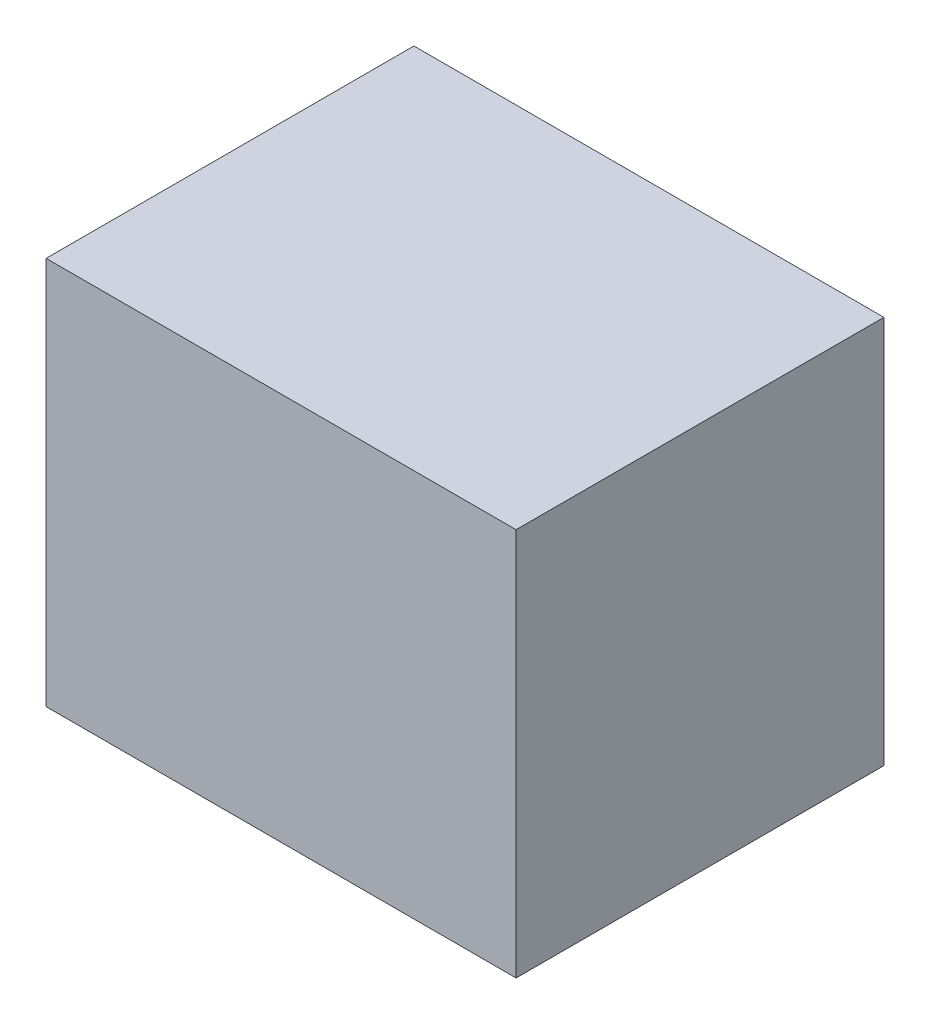
ISO-10303-21;
HEADER;
FILE_DESCRIPTION(('STEP AP214'),'2;1');
FILE_NAME('part.step','',(''),(''),'','','');
FILE_SCHEMA(('AUTOMOTIVE_DESIGN { 1 0 10303 214 1 1 1 1 }'));
ENDSEC;
DATA;
#1=APPLICATION_CONTEXT('core data for automotive mechanical design processes');
#2=APPLICATION_PROTOCOL_DEFINITION('international standard','automotive_design',2000,#1);
#3=PRODUCT_CONTEXT('',#1,'mechanical');
#4=PRODUCT('Part','Part','',(#3));
#5=PRODUCT_RELATED_PRODUCT_CATEGORY('part','',(#4));
#6=PRODUCT_DEFINITION_FORMATION('','',#4);
#7=PRODUCT_DEFINITION_CONTEXT('part definition',#1,'design');
#8=PRODUCT_DEFINITION('design','',#6,#7);
#9=PRODUCT_DEFINITION_SHAPE('','',#8);
#10=(LENGTH_UNIT() NAMED_UNIT(*) SI_UNIT(.MILLI.,.METRE.));
#11=(NAMED_UNIT(*) PLANE_ANGLE_UNIT() SI_UNIT($,.RADIAN.));
#12=(NAMED_UNIT(*) SI_UNIT($,.STERADIAN.) SOLID_ANGLE_UNIT());
#13=UNCERTAINTY_MEASURE_WITH_UNIT(LENGTH_MEASURE(1.E-05),#10,'distance_accuracy_value','');
#14=(GEOMETRIC_REPRESENTATION_CONTEXT(3) GLOBAL_UNCERTAINTY_ASSIGNED_CONTEXT((#13)) GLOBAL_UNIT_ASSIGNED_CONTEXT((#10,
#11,#12)) REPRESENTATION_CONTEXT('',''));
#15=CARTESIAN_POINT('',(0.,0.,0.));
#16=DIRECTION('',(0.,0.,1.));
#17=DIRECTION('',(1.,0.,0.));
#18=AXIS2_PLACEMENT_3D('',#15,#16,#17);
#19=CARTESIAN_POINT('',(0.57500012,0.47500032,0.));
#20=DIRECTION('',(1.,0.,0.));
#21=DIRECTION('',(0.,-1.,0.));
#22=AXIS2_PLACEMENT_3D('',#19,#20,#21);
#23=PLANE('',#22);
#24=DIRECTION('',(0.,0.,1.));
#25=VECTOR('',#24,1.);
#26=CARTESIAN_POINT('',(0.57500012,0.47500032,0.));
#27=LINE('',#26,#25);
#28=CARTESIAN_POINT('',(0.57500012,0.47500032,0.));
#29=VERTEX_POINT('',#28);
#30=CARTESIAN_POINT('',(0.57500012,0.47500032,0.90000074));
#31=VERTEX_POINT('',#30);
#32=EDGE_CURVE('E11',#29,#31,#27,.T.);
#33=ORIENTED_EDGE('',*,*,#32,.T.);
#34=DIRECTION('',(0.,-1.,0.));
#35=VECTOR('',#34,1.);
#36=CARTESIAN_POINT('',(0.57500012,0.47500032,0.90000074));
#37=LINE('',#36,#35);
#38=CARTESIAN_POINT('',(0.57500012,-0.47500032,0.90000074));
#39=VERTEX_POINT('',#38);
#40=EDGE_CURVE('E24',#31,#39,#37,.T.);
#41=ORIENTED_EDGE('',*,*,#40,.T.);
#42=DIRECTION('',(0.,0.,1.));
#43=VECTOR('',#42,1.);
#44=CARTESIAN_POINT('',(0.57500012,-0.47500032,0.));
#45=LINE('',#44,#43);
#46=CARTESIAN_POINT('',(0.57500012,-0.47500032,0.));
#47=VERTEX_POINT('',#46);
#48=EDGE_CURVE('E85',#47,#39,#45,.T.);
#49=ORIENTED_EDGE('',*,*,#48,.F.);
#50=DIRECTION('',(0.,-1.,0.));
#51=VECTOR('',#50,1.);
#52=CARTESIAN_POINT('',(0.57500012,0.47500032,0.));
#53=LINE('',#52,#51);
#54=EDGE_CURVE('E83',#29,#47,#53,.T.);
#55=ORIENTED_EDGE('',*,*,#54,.F.);
#56=EDGE_LOOP('',(#33,#41,#49,#55));
#57=FACE_BOUND('',#56,.T.);
#58=ADVANCED_FACE('F17',(#57),#23,.T.);
#59=CARTESIAN_POINT('',(0.57500012,-0.47500032,0.));
#60=DIRECTION('',(0.,-1.,0.));
#61=DIRECTION('',(-1.,0.,0.));
#62=AXIS2_PLACEMENT_3D('',#59,#60,#61);
#63=PLANE('',#62);
#64=ORIENTED_EDGE('',*,*,#48,.T.);
#65=DIRECTION('',(-1.,0.,0.));
#66=VECTOR('',#65,1.);
#67=CARTESIAN_POINT('',(0.57500012,-0.47500032,0.90000074));
#68=LINE('',#67,#66);
#69=CARTESIAN_POINT('',(-0.57500012,-0.47500032,0.90000074));
#70=VERTEX_POINT('',#69);
#71=EDGE_CURVE('E81',#39,#70,#68,.T.);
#72=ORIENTED_EDGE('',*,*,#71,.T.);
#73=DIRECTION('',(0.,0.,1.));
#74=VECTOR('',#73,1.);
#75=CARTESIAN_POINT('',(-0.57500012,-0.47500032,0.));
#76=LINE('',#75,#74);
#77=CARTESIAN_POINT('',(-0.57500012,-0.47500032,0.));
#78=VERTEX_POINT('',#77);
#79=EDGE_CURVE('E79',#78,#70,#76,.T.);
#80=ORIENTED_EDGE('',*,*,#79,.F.);
#81=DIRECTION('',(-1.,0.,0.));
#82=VECTOR('',#81,1.);
#83=CARTESIAN_POINT('',(0.57500012,-0.47500032,0.));
#84=LINE('',#83,#82);
#85=EDGE_CURVE('E70',#47,#78,#84,.T.);
#86=ORIENTED_EDGE('',*,*,#85,.F.);
#87=EDGE_LOOP('',(#64,#72,#80,#86));
#88=FACE_BOUND('',#87,.T.);
#89=ADVANCED_FACE('F90',(#88),#63,.T.);
#90=CARTESIAN_POINT('',(-0.57500012,-0.47500032,0.));
#91=DIRECTION('',(-1.,0.,0.));
#92=DIRECTION('',(0.,1.,0.));
#93=AXIS2_PLACEMENT_3D('',#90,#91,#92);
#94=PLANE('',#93);
#95=ORIENTED_EDGE('',*,*,#79,.T.);
#96=DIRECTION('',(0.,1.,0.));
#97=VECTOR('',#96,1.);
#98=CARTESIAN_POINT('',(-0.57500012,-0.47500032,0.90000074));
#99=LINE('',#98,#97);
#100=CARTESIAN_POINT('',(-0.57500012,0.47500032,0.90000074));
#101=VERTEX_POINT('',#100);
#102=EDGE_CURVE('E60',#70,#101,#99,.T.);
#103=ORIENTED_EDGE('',*,*,#102,.T.);
#104=DIRECTION('',(0.,0.,1.));
#105=VECTOR('',#104,1.);
#106=CARTESIAN_POINT('',(-0.57500012,0.47500032,0.));
#107=LINE('',#106,#105);
#108=CARTESIAN_POINT('',(-0.57500012,0.47500032,0.));
#109=VERTEX_POINT('',#108);
#110=EDGE_CURVE('E54',#109,#101,#107,.T.);
#111=ORIENTED_EDGE('',*,*,#110,.F.);
#112=DIRECTION('',(0.,1.,0.));
#113=VECTOR('',#112,1.);
#114=CARTESIAN_POINT('',(-0.57500012,-0.47500032,0.));
#115=LINE('',#114,#113);
#116=EDGE_CURVE('E58',#78,#109,#115,.T.);
#117=ORIENTED_EDGE('',*,*,#116,.F.);
#118=EDGE_LOOP('',(#95,#103,#111,#117));
#119=FACE_BOUND('',#118,.T.);
#120=ADVANCED_FACE('F57',(#119),#94,.T.);
#121=CARTESIAN_POINT('',(-0.57500012,0.47500032,0.));
#122=DIRECTION('',(0.,1.,0.));
#123=DIRECTION('',(1.,0.,0.));
#124=AXIS2_PLACEMENT_3D('',#121,#122,#123);
#125=PLANE('',#124);
#126=ORIENTED_EDGE('',*,*,#110,.T.);
#127=DIRECTION('',(1.,0.,0.));
#128=VECTOR('',#127,1.);
#129=CARTESIAN_POINT('',(-0.57500012,0.47500032,0.90000074));
#130=LINE('',#129,#128);
#131=EDGE_CURVE('E71',#101,#31,#130,.T.);
#132=ORIENTED_EDGE('',*,*,#131,.T.);
#133=ORIENTED_EDGE('',*,*,#32,.F.);
#134=DIRECTION('',(1.,0.,0.));
#135=VECTOR('',#134,1.);
#136=CARTESIAN_POINT('',(-0.57500012,0.47500032,0.));
#137=LINE('',#136,#135);
#138=EDGE_CURVE('E68',#109,#29,#137,.T.);
#139=ORIENTED_EDGE('',*,*,#138,.F.);
#140=EDGE_LOOP('',(#126,#132,#133,#139));
#141=FACE_BOUND('',#140,.T.);
#142=ADVANCED_FACE('F73',(#141),#125,.T.);
#143=CARTESIAN_POINT('',(0.,0.,0.));
#144=DIRECTION('',(0.,0.,-1.));
#145=DIRECTION('',(-1.,0.,0.));
#146=AXIS2_PLACEMENT_3D('',#143,#144,#145);
#147=PLANE('',#146);
#148=ORIENTED_EDGE('',*,*,#54,.T.);
#149=ORIENTED_EDGE('',*,*,#85,.T.);
#150=ORIENTED_EDGE('',*,*,#116,.T.);
#151=ORIENTED_EDGE('',*,*,#138,.T.);
#152=EDGE_LOOP('',(#148,#149,#150,#151));
#153=FACE_BOUND('',#152,.T.);
#154=ADVANCED_FACE('F67',(#153),#147,.T.);
#155=CARTESIAN_POINT('',(0.,0.,0.90000074));
#156=DIRECTION('',(0.,0.,-1.));
#157=DIRECTION('',(-1.,0.,0.));
#158=AXIS2_PLACEMENT_3D('',#155,#156,#157);
#159=PLANE('',#158);
#160=ORIENTED_EDGE('',*,*,#131,.F.);
#161=ORIENTED_EDGE('',*,*,#102,.F.);
#162=ORIENTED_EDGE('',*,*,#71,.F.);
#163=ORIENTED_EDGE('',*,*,#40,.F.);
#164=EDGE_LOOP('',(#160,#161,#162,#163));
#165=FACE_BOUND('',#164,.T.);
#166=ADVANCED_FACE('F91',(#165),#159,.F.);
#167=CLOSED_SHELL('',(#58,#89,#120,#142,#154,#166));
#168=MANIFOLD_SOLID_BREP('B1',#167);
#169=ADVANCED_BREP_SHAPE_REPRESENTATION('',(#18,#168),#14);
#170=SHAPE_DEFINITION_REPRESENTATION(#9,#169);
ENDSEC;
END-ISO-10303-21;
